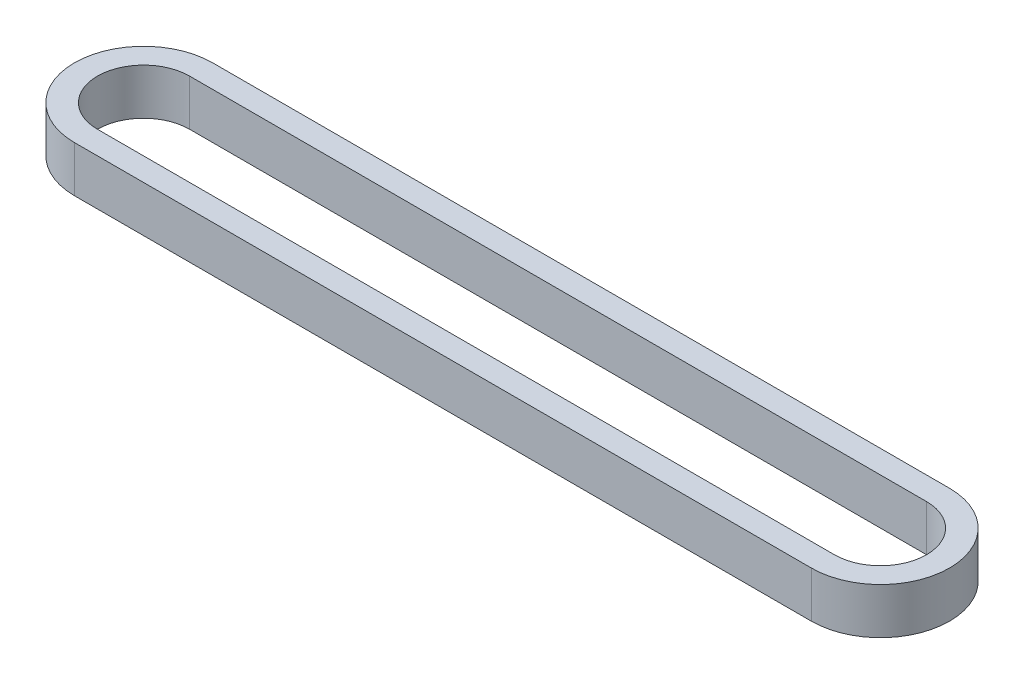
ISO-10303-21;
HEADER;
FILE_DESCRIPTION(('STEP AP214'),'2;1');
FILE_NAME('part.step','',(''),(''),'','','');
FILE_SCHEMA(('AUTOMOTIVE_DESIGN { 1 0 10303 214 1 1 1 1 }'));
ENDSEC;
DATA;
#1=APPLICATION_CONTEXT('core data for automotive mechanical design processes');
#2=APPLICATION_PROTOCOL_DEFINITION('international standard','automotive_design',2000,#1);
#3=PRODUCT_CONTEXT('',#1,'mechanical');
#4=PRODUCT('Part','Part','',(#3));
#5=PRODUCT_RELATED_PRODUCT_CATEGORY('part','',(#4));
#6=PRODUCT_DEFINITION_FORMATION('','',#4);
#7=PRODUCT_DEFINITION_CONTEXT('part definition',#1,'design');
#8=PRODUCT_DEFINITION('design','',#6,#7);
#9=PRODUCT_DEFINITION_SHAPE('','',#8);
#10=(LENGTH_UNIT() NAMED_UNIT(*) SI_UNIT(.MILLI.,.METRE.));
#11=(NAMED_UNIT(*) PLANE_ANGLE_UNIT() SI_UNIT($,.RADIAN.));
#12=(NAMED_UNIT(*) SI_UNIT($,.STERADIAN.) SOLID_ANGLE_UNIT());
#13=UNCERTAINTY_MEASURE_WITH_UNIT(LENGTH_MEASURE(1.E-05),#10,'distance_accuracy_value','');
#14=(GEOMETRIC_REPRESENTATION_CONTEXT(3) GLOBAL_UNCERTAINTY_ASSIGNED_CONTEXT((#13)) GLOBAL_UNIT_ASSIGNED_CONTEXT((#10,
#11,#12)) REPRESENTATION_CONTEXT('',''));
#15=CARTESIAN_POINT('',(0.,0.,0.));
#16=DIRECTION('',(0.,0.,1.));
#17=DIRECTION('',(1.,0.,0.));
#18=AXIS2_PLACEMENT_3D('',#15,#16,#17);
#19=CARTESIAN_POINT('',(-16.,2.,0.));
#20=DIRECTION('',(0.,1.,0.));
#21=DIRECTION('',(0.,0.,1.));
#22=AXIS2_PLACEMENT_3D('',#19,#20,#21);
#23=PLANE('',#22);
#24=CARTESIAN_POINT('',(-16.,2.,0.));
#25=DIRECTION('',(0.,1.,0.));
#26=DIRECTION('',(0.,0.,1.));
#27=AXIS2_PLACEMENT_3D('',#24,#25,#26);
#28=CIRCLE('',#27,3.00000000000001);
#29=CARTESIAN_POINT('',(-16.,2.,-3.00000000000001));
#30=VERTEX_POINT('',#29);
#31=CARTESIAN_POINT('',(-16.,2.,3.00000000000001));
#32=VERTEX_POINT('',#31);
#33=EDGE_CURVE('E136',#30,#32,#28,.T.);
#34=ORIENTED_EDGE('',*,*,#33,.T.);
#35=DIRECTION('',(1.,0.,0.));
#36=VECTOR('',#35,1.);
#37=CARTESIAN_POINT('',(-16.,2.,3.00000000000001));
#38=LINE('',#37,#36);
#39=CARTESIAN_POINT('',(16.,2.,3.));
#40=VERTEX_POINT('',#39);
#41=EDGE_CURVE('E139',#32,#40,#38,.T.);
#42=ORIENTED_EDGE('',*,*,#41,.T.);
#43=CARTESIAN_POINT('',(16.,2.,0.));
#44=DIRECTION('',(0.,1.,0.));
#45=DIRECTION('',(0.,0.,1.));
#46=AXIS2_PLACEMENT_3D('',#43,#44,#45);
#47=CIRCLE('',#46,3.00000000000001);
#48=CARTESIAN_POINT('',(16.,2.,-3.00000000000001));
#49=VERTEX_POINT('',#48);
#50=EDGE_CURVE('E142',#40,#49,#47,.T.);
#51=ORIENTED_EDGE('',*,*,#50,.T.);
#52=DIRECTION('',(-1.,0.,0.));
#53=VECTOR('',#52,1.);
#54=CARTESIAN_POINT('',(-16.,2.,-3.00000000000001));
#55=LINE('',#54,#53);
#56=EDGE_CURVE('E144',#49,#30,#55,.T.);
#57=ORIENTED_EDGE('',*,*,#56,.T.);
#58=EDGE_LOOP('',(#34,#42,#51,#57));
#59=FACE_BOUND('',#58,.T.);
#60=DIRECTION('',(1.,0.,0.));
#61=VECTOR('',#60,1.);
#62=CARTESIAN_POINT('',(-16.,2.,2.00000000000001));
#63=LINE('',#62,#61);
#64=CARTESIAN_POINT('',(-16.,2.,2.00000000000001));
#65=VERTEX_POINT('',#64);
#66=CARTESIAN_POINT('',(16.,2.,2.));
#67=VERTEX_POINT('',#66);
#68=EDGE_CURVE('E108',#65,#67,#63,.T.);
#69=ORIENTED_EDGE('',*,*,#68,.F.);
#70=CARTESIAN_POINT('',(-16.,2.,0.));
#71=DIRECTION('',(0.,1.,0.));
#72=DIRECTION('',(0.,0.,1.));
#73=AXIS2_PLACEMENT_3D('',#70,#71,#72);
#74=CIRCLE('',#73,2.00000000000001);
#75=CARTESIAN_POINT('',(-16.,2.,-2.00000000000001));
#76=VERTEX_POINT('',#75);
#77=EDGE_CURVE('E100',#76,#65,#74,.T.);
#78=ORIENTED_EDGE('',*,*,#77,.F.);
#79=DIRECTION('',(-1.,0.,0.));
#80=VECTOR('',#79,1.);
#81=CARTESIAN_POINT('',(-16.,2.,-2.00000000000001));
#82=LINE('',#81,#80);
#83=CARTESIAN_POINT('',(16.,2.,-2.00000000000001));
#84=VERTEX_POINT('',#83);
#85=EDGE_CURVE('E122',#84,#76,#82,.T.);
#86=ORIENTED_EDGE('',*,*,#85,.F.);
#87=CARTESIAN_POINT('',(16.,2.,0.));
#88=DIRECTION('',(0.,1.,0.));
#89=DIRECTION('',(0.,0.,1.));
#90=AXIS2_PLACEMENT_3D('',#87,#88,#89);
#91=CIRCLE('',#90,2.00000000000001);
#92=EDGE_CURVE('E120',#67,#84,#91,.T.);
#93=ORIENTED_EDGE('',*,*,#92,.F.);
#94=EDGE_LOOP('',(#69,#78,#86,#93));
#95=FACE_BOUND('',#94,.T.);
#96=ADVANCED_FACE('F35',(#59,#95),#23,.T.);
#97=CARTESIAN_POINT('',(-16.,0.,0.));
#98=DIRECTION('',(0.,1.,0.));
#99=DIRECTION('',(0.,0.,1.));
#100=AXIS2_PLACEMENT_3D('',#97,#98,#99);
#101=PLANE('',#100);
#102=CARTESIAN_POINT('',(-16.,0.,0.));
#103=DIRECTION('',(0.,1.,0.));
#104=DIRECTION('',(0.,0.,1.));
#105=AXIS2_PLACEMENT_3D('',#102,#103,#104);
#106=CIRCLE('',#105,3.00000000000001);
#107=CARTESIAN_POINT('',(-16.,0.,-3.00000000000001));
#108=VERTEX_POINT('',#107);
#109=CARTESIAN_POINT('',(-16.,0.,3.00000000000001));
#110=VERTEX_POINT('',#109);
#111=EDGE_CURVE('E116',#108,#110,#106,.T.);
#112=ORIENTED_EDGE('',*,*,#111,.F.);
#113=DIRECTION('',(-1.,0.,0.));
#114=VECTOR('',#113,1.);
#115=CARTESIAN_POINT('',(-16.,0.,-3.00000000000001));
#116=LINE('',#115,#114);
#117=CARTESIAN_POINT('',(16.,0.,-3.00000000000001));
#118=VERTEX_POINT('',#117);
#119=EDGE_CURVE('E140',#118,#108,#116,.T.);
#120=ORIENTED_EDGE('',*,*,#119,.F.);
#121=CARTESIAN_POINT('',(16.,0.,0.));
#122=DIRECTION('',(0.,1.,0.));
#123=DIRECTION('',(0.,0.,1.));
#124=AXIS2_PLACEMENT_3D('',#121,#122,#123);
#125=CIRCLE('',#124,3.00000000000001);
#126=CARTESIAN_POINT('',(16.,0.,3.));
#127=VERTEX_POINT('',#126);
#128=EDGE_CURVE('E151',#127,#118,#125,.T.);
#129=ORIENTED_EDGE('',*,*,#128,.F.);
#130=DIRECTION('',(1.,0.,0.));
#131=VECTOR('',#130,1.);
#132=CARTESIAN_POINT('',(-16.,0.,3.00000000000001));
#133=LINE('',#132,#131);
#134=EDGE_CURVE('E149',#110,#127,#133,.T.);
#135=ORIENTED_EDGE('',*,*,#134,.F.);
#136=EDGE_LOOP('',(#112,#120,#129,#135));
#137=FACE_BOUND('',#136,.T.);
#138=CARTESIAN_POINT('',(-16.,0.,0.));
#139=DIRECTION('',(0.,1.,0.));
#140=DIRECTION('',(0.,0.,1.));
#141=AXIS2_PLACEMENT_3D('',#138,#139,#140);
#142=CIRCLE('',#141,2.00000000000001);
#143=CARTESIAN_POINT('',(-16.,0.,-2.00000000000001));
#144=VERTEX_POINT('',#143);
#145=CARTESIAN_POINT('',(-16.,0.,2.00000000000001));
#146=VERTEX_POINT('',#145);
#147=EDGE_CURVE('E58',#144,#146,#142,.T.);
#148=ORIENTED_EDGE('',*,*,#147,.T.);
#149=DIRECTION('',(1.,0.,0.));
#150=VECTOR('',#149,1.);
#151=CARTESIAN_POINT('',(-16.,0.,2.00000000000001));
#152=LINE('',#151,#150);
#153=CARTESIAN_POINT('',(16.,0.,2.));
#154=VERTEX_POINT('',#153);
#155=EDGE_CURVE('E115',#146,#154,#152,.T.);
#156=ORIENTED_EDGE('',*,*,#155,.T.);
#157=CARTESIAN_POINT('',(16.,0.,0.));
#158=DIRECTION('',(0.,1.,0.));
#159=DIRECTION('',(0.,0.,1.));
#160=AXIS2_PLACEMENT_3D('',#157,#158,#159);
#161=CIRCLE('',#160,2.00000000000001);
#162=CARTESIAN_POINT('',(16.,0.,-2.00000000000001));
#163=VERTEX_POINT('',#162);
#164=EDGE_CURVE('E128',#154,#163,#161,.T.);
#165=ORIENTED_EDGE('',*,*,#164,.T.);
#166=DIRECTION('',(-1.,0.,0.));
#167=VECTOR('',#166,1.);
#168=CARTESIAN_POINT('',(-16.,0.,-2.00000000000001));
#169=LINE('',#168,#167);
#170=EDGE_CURVE('E109',#163,#144,#169,.T.);
#171=ORIENTED_EDGE('',*,*,#170,.T.);
#172=EDGE_LOOP('',(#148,#156,#165,#171));
#173=FACE_BOUND('',#172,.T.);
#174=ADVANCED_FACE('F169',(#137,#173),#101,.F.);
#175=CARTESIAN_POINT('',(-16.,2.,0.));
#176=DIRECTION('',(0.,-1.,0.));
#177=DIRECTION('',(0.,0.,-1.));
#178=AXIS2_PLACEMENT_3D('',#175,#176,#177);
#179=CYLINDRICAL_SURFACE('',#178,3.00000000000001);
#180=ORIENTED_EDGE('',*,*,#111,.T.);
#181=DIRECTION('',(0.,-1.,0.));
#182=VECTOR('',#181,1.);
#183=CARTESIAN_POINT('',(-16.,2.,3.00000000000001));
#184=LINE('',#183,#182);
#185=EDGE_CURVE('E11',#32,#110,#184,.T.);
#186=ORIENTED_EDGE('',*,*,#185,.F.);
#187=ORIENTED_EDGE('',*,*,#33,.F.);
#188=DIRECTION('',(0.,-1.,0.));
#189=VECTOR('',#188,1.);
#190=CARTESIAN_POINT('',(-16.,2.,-3.00000000000001));
#191=LINE('',#190,#189);
#192=EDGE_CURVE('E146',#30,#108,#191,.T.);
#193=ORIENTED_EDGE('',*,*,#192,.T.);
#194=EDGE_LOOP('',(#180,#186,#187,#193));
#195=FACE_BOUND('',#194,.T.);
#196=ADVANCED_FACE('F37',(#195),#179,.T.);
#197=CARTESIAN_POINT('',(-16.,2.,3.00000000000001));
#198=DIRECTION('',(0.,0.,-1.));
#199=DIRECTION('',(-1.,0.,0.));
#200=AXIS2_PLACEMENT_3D('',#197,#198,#199);
#201=PLANE('',#200);
#202=ORIENTED_EDGE('',*,*,#134,.T.);
#203=DIRECTION('',(0.,-1.,0.));
#204=VECTOR('',#203,1.);
#205=CARTESIAN_POINT('',(16.,2.,3.));
#206=LINE('',#205,#204);
#207=EDGE_CURVE('E43',#40,#127,#206,.T.);
#208=ORIENTED_EDGE('',*,*,#207,.F.);
#209=ORIENTED_EDGE('',*,*,#41,.F.);
#210=ORIENTED_EDGE('',*,*,#185,.T.);
#211=EDGE_LOOP('',(#202,#208,#209,#210));
#212=FACE_BOUND('',#211,.T.);
#213=ADVANCED_FACE('F179',(#212),#201,.F.);
#214=CARTESIAN_POINT('',(16.,2.,0.));
#215=DIRECTION('',(0.,-1.,0.));
#216=DIRECTION('',(0.,0.,-1.));
#217=AXIS2_PLACEMENT_3D('',#214,#215,#216);
#218=CYLINDRICAL_SURFACE('',#217,3.00000000000001);
#219=ORIENTED_EDGE('',*,*,#128,.T.);
#220=DIRECTION('',(0.,-1.,0.));
#221=VECTOR('',#220,1.);
#222=CARTESIAN_POINT('',(16.,2.,-3.00000000000001));
#223=LINE('',#222,#221);
#224=EDGE_CURVE('E156',#49,#118,#223,.T.);
#225=ORIENTED_EDGE('',*,*,#224,.F.);
#226=ORIENTED_EDGE('',*,*,#50,.F.);
#227=ORIENTED_EDGE('',*,*,#207,.T.);
#228=EDGE_LOOP('',(#219,#225,#226,#227));
#229=FACE_BOUND('',#228,.T.);
#230=ADVANCED_FACE('F163',(#229),#218,.T.);
#231=CARTESIAN_POINT('',(-16.,2.,-3.00000000000001));
#232=DIRECTION('',(0.,0.,1.));
#233=DIRECTION('',(1.,0.,0.));
#234=AXIS2_PLACEMENT_3D('',#231,#232,#233);
#235=PLANE('',#234);
#236=ORIENTED_EDGE('',*,*,#119,.T.);
#237=ORIENTED_EDGE('',*,*,#192,.F.);
#238=ORIENTED_EDGE('',*,*,#56,.F.);
#239=ORIENTED_EDGE('',*,*,#224,.T.);
#240=EDGE_LOOP('',(#236,#237,#238,#239));
#241=FACE_BOUND('',#240,.T.);
#242=ADVANCED_FACE('F173',(#241),#235,.F.);
#243=CARTESIAN_POINT('',(-16.,2.,0.));
#244=DIRECTION('',(0.,-1.,0.));
#245=DIRECTION('',(0.,0.,-1.));
#246=AXIS2_PLACEMENT_3D('',#243,#244,#245);
#247=CYLINDRICAL_SURFACE('',#246,2.00000000000001);
#248=ORIENTED_EDGE('',*,*,#147,.F.);
#249=DIRECTION('',(0.,-1.,0.));
#250=VECTOR('',#249,1.);
#251=CARTESIAN_POINT('',(-16.,2.,-2.00000000000001));
#252=LINE('',#251,#250);
#253=EDGE_CURVE('E104',#76,#144,#252,.T.);
#254=ORIENTED_EDGE('',*,*,#253,.F.);
#255=ORIENTED_EDGE('',*,*,#77,.T.);
#256=DIRECTION('',(0.,-1.,0.));
#257=VECTOR('',#256,1.);
#258=CARTESIAN_POINT('',(-16.,2.,2.00000000000001));
#259=LINE('',#258,#257);
#260=EDGE_CURVE('E103',#65,#146,#259,.T.);
#261=ORIENTED_EDGE('',*,*,#260,.T.);
#262=EDGE_LOOP('',(#248,#254,#255,#261));
#263=FACE_BOUND('',#262,.T.);
#264=ADVANCED_FACE('F102',(#263),#247,.F.);
#265=CARTESIAN_POINT('',(-16.,2.,2.00000000000001));
#266=DIRECTION('',(0.,0.,-1.));
#267=DIRECTION('',(-1.,0.,0.));
#268=AXIS2_PLACEMENT_3D('',#265,#266,#267);
#269=PLANE('',#268);
#270=ORIENTED_EDGE('',*,*,#155,.F.);
#271=ORIENTED_EDGE('',*,*,#260,.F.);
#272=ORIENTED_EDGE('',*,*,#68,.T.);
#273=DIRECTION('',(0.,-1.,0.));
#274=VECTOR('',#273,1.);
#275=CARTESIAN_POINT('',(16.,2.,2.));
#276=LINE('',#275,#274);
#277=EDGE_CURVE('E117',#67,#154,#276,.T.);
#278=ORIENTED_EDGE('',*,*,#277,.T.);
#279=EDGE_LOOP('',(#270,#271,#272,#278));
#280=FACE_BOUND('',#279,.T.);
#281=ADVANCED_FACE('F112',(#280),#269,.T.);
#282=CARTESIAN_POINT('',(16.,2.,0.));
#283=DIRECTION('',(0.,-1.,0.));
#284=DIRECTION('',(0.,0.,-1.));
#285=AXIS2_PLACEMENT_3D('',#282,#283,#284);
#286=CYLINDRICAL_SURFACE('',#285,2.00000000000001);
#287=ORIENTED_EDGE('',*,*,#164,.F.);
#288=ORIENTED_EDGE('',*,*,#277,.F.);
#289=ORIENTED_EDGE('',*,*,#92,.T.);
#290=DIRECTION('',(0.,-1.,0.));
#291=VECTOR('',#290,1.);
#292=CARTESIAN_POINT('',(16.,2.,-2.00000000000001));
#293=LINE('',#292,#291);
#294=EDGE_CURVE('E50',#84,#163,#293,.T.);
#295=ORIENTED_EDGE('',*,*,#294,.T.);
#296=EDGE_LOOP('',(#287,#288,#289,#295));
#297=FACE_BOUND('',#296,.T.);
#298=ADVANCED_FACE('F202',(#297),#286,.F.);
#299=CARTESIAN_POINT('',(-16.,2.,-2.00000000000001));
#300=DIRECTION('',(0.,0.,1.));
#301=DIRECTION('',(1.,0.,0.));
#302=AXIS2_PLACEMENT_3D('',#299,#300,#301);
#303=PLANE('',#302);
#304=ORIENTED_EDGE('',*,*,#170,.F.);
#305=ORIENTED_EDGE('',*,*,#294,.F.);
#306=ORIENTED_EDGE('',*,*,#85,.T.);
#307=ORIENTED_EDGE('',*,*,#253,.T.);
#308=EDGE_LOOP('',(#304,#305,#306,#307));
#309=FACE_BOUND('',#308,.T.);
#310=ADVANCED_FACE('F206',(#309),#303,.T.);
#311=CLOSED_SHELL('',(#96,#174,#196,#213,#230,#242,#264,#281,#298,#310));
#312=MANIFOLD_SOLID_BREP('B2',#311);
#313=ADVANCED_BREP_SHAPE_REPRESENTATION('',(#18,#312),#14);
#314=SHAPE_DEFINITION_REPRESENTATION(#9,#313);
ENDSEC;
END-ISO-10303-21;
